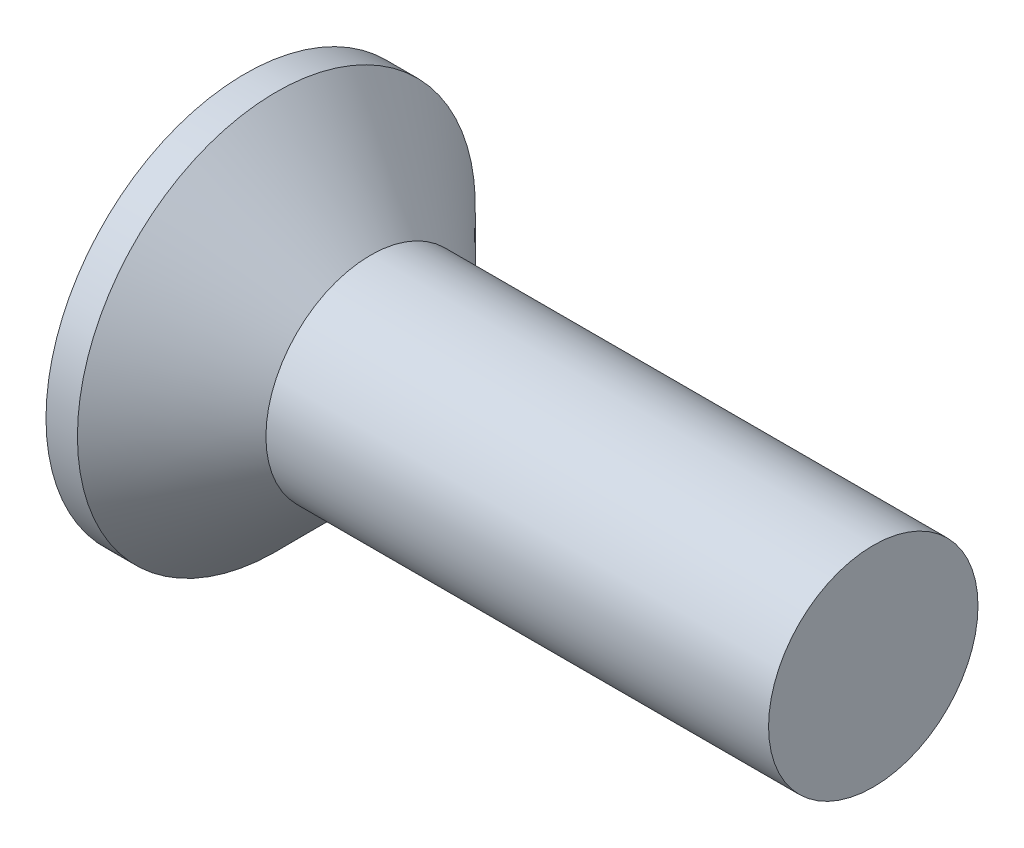
ISO-10303-21;
HEADER;
FILE_DESCRIPTION(('STEP AP214'),'2;1');
FILE_NAME('part.step','',(''),(''),'','','');
FILE_SCHEMA(('AUTOMOTIVE_DESIGN { 1 0 10303 214 1 1 1 1 }'));
ENDSEC;
DATA;
#1=APPLICATION_CONTEXT('core data for automotive mechanical design processes');
#2=APPLICATION_PROTOCOL_DEFINITION('international standard','automotive_design',2000,#1);
#3=PRODUCT_CONTEXT('',#1,'mechanical');
#4=PRODUCT('Part','Part','',(#3));
#5=PRODUCT_RELATED_PRODUCT_CATEGORY('part','',(#4));
#6=PRODUCT_DEFINITION_FORMATION('','',#4);
#7=PRODUCT_DEFINITION_CONTEXT('part definition',#1,'design');
#8=PRODUCT_DEFINITION('design','',#6,#7);
#9=PRODUCT_DEFINITION_SHAPE('','',#8);
#10=(LENGTH_UNIT() NAMED_UNIT(*) SI_UNIT(.MILLI.,.METRE.));
#11=(NAMED_UNIT(*) PLANE_ANGLE_UNIT() SI_UNIT($,.RADIAN.));
#12=(NAMED_UNIT(*) SI_UNIT($,.STERADIAN.) SOLID_ANGLE_UNIT());
#13=UNCERTAINTY_MEASURE_WITH_UNIT(LENGTH_MEASURE(1.E-05),#10,'distance_accuracy_value','');
#14=(GEOMETRIC_REPRESENTATION_CONTEXT(3) GLOBAL_UNCERTAINTY_ASSIGNED_CONTEXT((#13)) GLOBAL_UNIT_ASSIGNED_CONTEXT((#10,
#11,#12)) REPRESENTATION_CONTEXT('',''));
#15=CARTESIAN_POINT('',(0.,0.,0.));
#16=DIRECTION('',(0.,0.,1.));
#17=DIRECTION('',(1.,0.,0.));
#18=AXIS2_PLACEMENT_3D('',#15,#16,#17);
#19=CARTESIAN_POINT('',(0.,1.9,0.));
#20=DIRECTION('',(1.,0.,0.));
#21=DIRECTION('',(0.,0.,-1.));
#22=AXIS2_PLACEMENT_3D('',#19,#20,#21);
#23=PLANE('',#22);
#24=CARTESIAN_POINT('',(0.,0.,0.));
#25=DIRECTION('',(-1.,0.,0.));
#26=DIRECTION('',(0.,0.,1.));
#27=AXIS2_PLACEMENT_3D('',#24,#25,#26);
#28=CIRCLE('',#27,1.9);
#29=CARTESIAN_POINT('',(0.,0.,1.9));
#30=VERTEX_POINT('',#29);
#31=EDGE_CURVE('E45',#30,#30,#28,.T.);
#32=ORIENTED_EDGE('',*,*,#31,.T.);
#33=EDGE_LOOP('',(#32));
#34=FACE_BOUND('',#33,.T.);
#35=ADVANCED_FACE('F31',(#34),#23,.F.);
#36=CARTESIAN_POINT('',(6.,0.,0.));
#37=DIRECTION('',(-1.,0.,0.));
#38=DIRECTION('',(0.,0.,1.));
#39=AXIS2_PLACEMENT_3D('',#36,#37,#38);
#40=PLANE('',#39);
#41=CARTESIAN_POINT('',(6.,0.,0.));
#42=DIRECTION('',(-1.,0.,0.));
#43=DIRECTION('',(0.,0.,1.));
#44=AXIS2_PLACEMENT_3D('',#41,#42,#43);
#45=CIRCLE('',#44,1.);
#46=CARTESIAN_POINT('',(6.,0.,1.));
#47=VERTEX_POINT('',#46);
#48=EDGE_CURVE('E10',#47,#47,#45,.T.);
#49=ORIENTED_EDGE('',*,*,#48,.F.);
#50=EDGE_LOOP('',(#49));
#51=FACE_BOUND('',#50,.T.);
#52=ADVANCED_FACE('F65',(#51),#40,.F.);
#53=CARTESIAN_POINT('',(0.,0.,0.));
#54=DIRECTION('',(-1.,0.,0.));
#55=DIRECTION('',(0.,0.,1.));
#56=AXIS2_PLACEMENT_3D('',#53,#54,#55);
#57=CYLINDRICAL_SURFACE('',#56,1.);
#58=CARTESIAN_POINT('',(1.2,0.,0.));
#59=DIRECTION('',(-1.,0.,0.));
#60=DIRECTION('',(0.,0.,1.));
#61=AXIS2_PLACEMENT_3D('',#58,#59,#60);
#62=CIRCLE('',#61,0.999999999999999);
#63=CARTESIAN_POINT('',(1.2,0.,0.999999999999999));
#64=VERTEX_POINT('',#63);
#65=EDGE_CURVE('E37',#64,#64,#62,.T.);
#66=ORIENTED_EDGE('',*,*,#65,.F.);
#67=EDGE_LOOP('',(#66));
#68=FACE_BOUND('',#67,.T.);
#69=ORIENTED_EDGE('',*,*,#48,.T.);
#70=EDGE_LOOP('',(#69));
#71=FACE_BOUND('',#70,.T.);
#72=ADVANCED_FACE('F60',(#68,#71),#57,.T.);
#73=CARTESIAN_POINT('',(1.2,0.,0.));
#74=DIRECTION('',(-1.,0.,0.));
#75=DIRECTION('',(0.,0.,1.));
#76=AXIS2_PLACEMENT_3D('',#73,#74,#75);
#77=CONICAL_SURFACE('',#76,0.999999999999999,0.78539816339745);
#78=CARTESIAN_POINT('',(0.300000000000003,0.,0.));
#79=DIRECTION('',(-1.,0.,0.));
#80=DIRECTION('',(0.,0.,1.));
#81=AXIS2_PLACEMENT_3D('',#78,#79,#80);
#82=CIRCLE('',#81,1.9);
#83=CARTESIAN_POINT('',(0.300000000000003,0.,1.9));
#84=VERTEX_POINT('',#83);
#85=EDGE_CURVE('E41',#84,#84,#82,.T.);
#86=ORIENTED_EDGE('',*,*,#85,.F.);
#87=EDGE_LOOP('',(#86));
#88=FACE_BOUND('',#87,.T.);
#89=ORIENTED_EDGE('',*,*,#65,.T.);
#90=EDGE_LOOP('',(#89));
#91=FACE_BOUND('',#90,.T.);
#92=ADVANCED_FACE('F55',(#88,#91),#77,.T.);
#93=CARTESIAN_POINT('',(0.,0.,0.));
#94=DIRECTION('',(-1.,0.,0.));
#95=DIRECTION('',(0.,0.,1.));
#96=AXIS2_PLACEMENT_3D('',#93,#94,#95);
#97=CYLINDRICAL_SURFACE('',#96,1.9);
#98=ORIENTED_EDGE('',*,*,#31,.F.);
#99=EDGE_LOOP('',(#98));
#100=FACE_BOUND('',#99,.T.);
#101=ORIENTED_EDGE('',*,*,#85,.T.);
#102=EDGE_LOOP('',(#101));
#103=FACE_BOUND('',#102,.T.);
#104=ADVANCED_FACE('F52',(#100,#103),#97,.T.);
#105=CLOSED_SHELL('',(#35,#52,#72,#92,#104));
#106=MANIFOLD_SOLID_BREP('B2',#105);
#107=ADVANCED_BREP_SHAPE_REPRESENTATION('',(#18,#106),#14);
#108=SHAPE_DEFINITION_REPRESENTATION(#9,#107);
ENDSEC;
END-ISO-10303-21;
